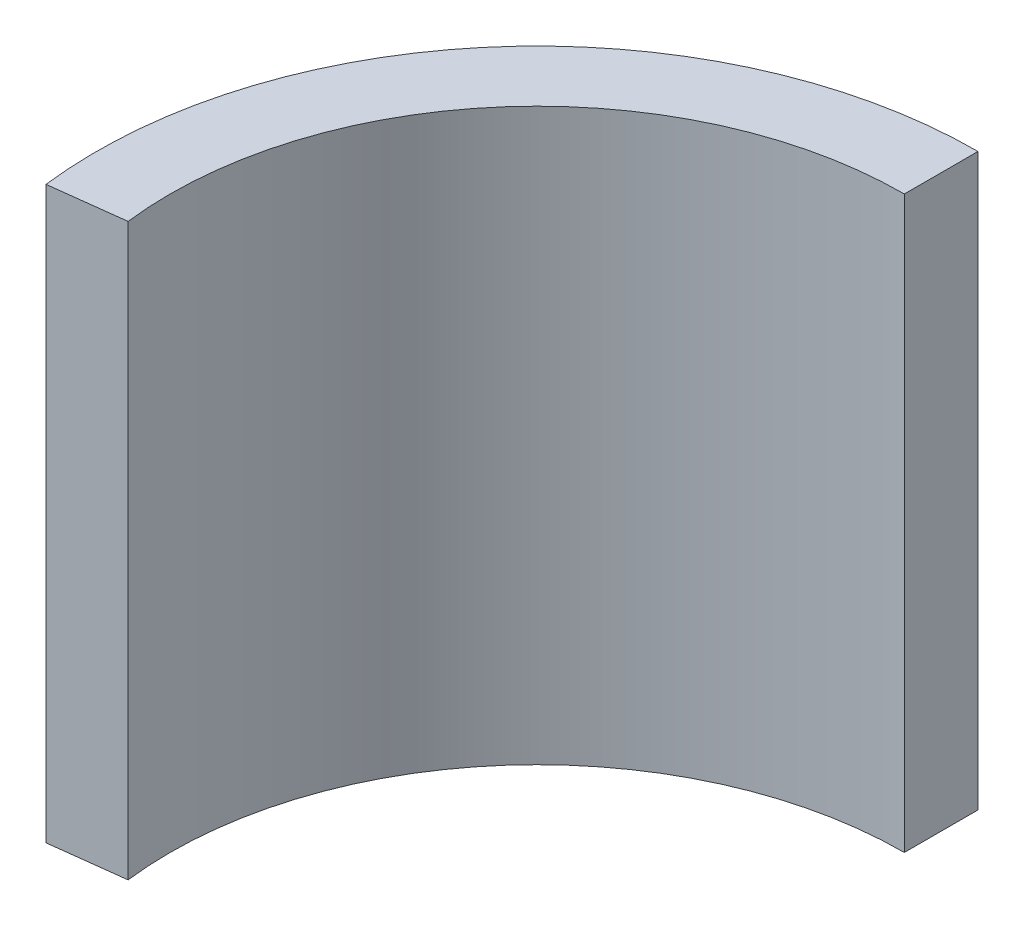
ISO-10303-21;
HEADER;
FILE_DESCRIPTION(('STEP AP214'),'2;1');
FILE_NAME('part.step','',(''),(''),'','','');
FILE_SCHEMA(('AUTOMOTIVE_DESIGN { 1 0 10303 214 1 1 1 1 }'));
ENDSEC;
DATA;
#1=APPLICATION_CONTEXT('core data for automotive mechanical design processes');
#2=APPLICATION_PROTOCOL_DEFINITION('international standard','automotive_design',2000,#1);
#3=PRODUCT_CONTEXT('',#1,'mechanical');
#4=PRODUCT('Part','Part','',(#3));
#5=PRODUCT_RELATED_PRODUCT_CATEGORY('part','',(#4));
#6=PRODUCT_DEFINITION_FORMATION('','',#4);
#7=PRODUCT_DEFINITION_CONTEXT('part definition',#1,'design');
#8=PRODUCT_DEFINITION('design','',#6,#7);
#9=PRODUCT_DEFINITION_SHAPE('','',#8);
#10=(LENGTH_UNIT() NAMED_UNIT(*) SI_UNIT(.MILLI.,.METRE.));
#11=(NAMED_UNIT(*) PLANE_ANGLE_UNIT() SI_UNIT($,.RADIAN.));
#12=(NAMED_UNIT(*) SI_UNIT($,.STERADIAN.) SOLID_ANGLE_UNIT());
#13=UNCERTAINTY_MEASURE_WITH_UNIT(LENGTH_MEASURE(1.E-05),#10,'distance_accuracy_value','');
#14=(GEOMETRIC_REPRESENTATION_CONTEXT(3) GLOBAL_UNCERTAINTY_ASSIGNED_CONTEXT((#13)) GLOBAL_UNIT_ASSIGNED_CONTEXT((#10,
#11,#12)) REPRESENTATION_CONTEXT('',''));
#15=CARTESIAN_POINT('',(0.,0.,0.));
#16=DIRECTION('',(0.,0.,1.));
#17=DIRECTION('',(1.,0.,0.));
#18=AXIS2_PLACEMENT_3D('',#15,#16,#17);
#19=CARTESIAN_POINT('',(0.,-18.,6.));
#20=DIRECTION('',(0.,-1.,0.));
#21=DIRECTION('',(0.,0.,-1.));
#22=AXIS2_PLACEMENT_3D('',#19,#20,#21);
#23=CYLINDRICAL_SURFACE('',#22,18.55);
#24=CARTESIAN_POINT('',(0.,-9.,6.));
#25=DIRECTION('',(0.,-1.,0.));
#26=DIRECTION('',(0.,0.,-1.));
#27=AXIS2_PLACEMENT_3D('',#24,#25,#26);
#28=CIRCLE('',#27,18.55);
#29=CARTESIAN_POINT('',(-18.4117311129465,-9.,8.26067632016548));
#30=VERTEX_POINT('',#29);
#31=CARTESIAN_POINT('',(0.,-9.,-12.55));
#32=VERTEX_POINT('',#31);
#33=EDGE_CURVE('E11',#30,#32,#28,.T.);
#34=ORIENTED_EDGE('',*,*,#33,.F.);
#35=DIRECTION('',(0.,1.,0.));
#36=VECTOR('',#35,1.);
#37=CARTESIAN_POINT('',(-18.4117311129465,-9.,8.26067632016548));
#38=LINE('',#37,#36);
#39=CARTESIAN_POINT('',(-18.4117311129465,15.,8.26067632016548));
#40=VERTEX_POINT('',#39);
#41=EDGE_CURVE('E87',#30,#40,#38,.T.);
#42=ORIENTED_EDGE('',*,*,#41,.T.);
#43=CARTESIAN_POINT('',(0.,15.,6.));
#44=DIRECTION('',(0.,-1.,0.));
#45=DIRECTION('',(0.,0.,-1.));
#46=AXIS2_PLACEMENT_3D('',#43,#44,#45);
#47=CIRCLE('',#46,18.55);
#48=CARTESIAN_POINT('',(0.,15.,-12.55));
#49=VERTEX_POINT('',#48);
#50=EDGE_CURVE('E84',#40,#49,#47,.T.);
#51=ORIENTED_EDGE('',*,*,#50,.T.);
#52=DIRECTION('',(0.,1.,0.));
#53=VECTOR('',#52,1.);
#54=CARTESIAN_POINT('',(0.,-9.,-12.55));
#55=LINE('',#54,#53);
#56=EDGE_CURVE('E81',#32,#49,#55,.T.);
#57=ORIENTED_EDGE('',*,*,#56,.F.);
#58=EDGE_LOOP('',(#34,#42,#51,#57));
#59=FACE_BOUND('',#58,.T.);
#60=ADVANCED_FACE('F44',(#59),#23,.T.);
#61=CARTESIAN_POINT('',(-18.4117311129465,-9.,8.26067632016548));
#62=DIRECTION('',(0.,1.,0.));
#63=DIRECTION('',(0.,0.,1.));
#64=AXIS2_PLACEMENT_3D('',#61,#62,#63);
#65=PLANE('',#64);
#66=CARTESIAN_POINT('',(0.,-9.,6.));
#67=DIRECTION('',(0.,-1.,0.));
#68=DIRECTION('',(0.,0.,-1.));
#69=AXIS2_PLACEMENT_3D('',#66,#67,#68);
#70=CIRCLE('',#69,15.45);
#71=CARTESIAN_POINT('',(-15.3348380428584,-9.,7.88288135560953));
#72=VERTEX_POINT('',#71);
#73=CARTESIAN_POINT('',(0.,-9.,-9.45));
#74=VERTEX_POINT('',#73);
#75=EDGE_CURVE('E53',#72,#74,#70,.T.);
#76=ORIENTED_EDGE('',*,*,#75,.F.);
#77=DIRECTION('',(0.992546151641322,0.,-0.121869343405147));
#78=VECTOR('',#77,1.);
#79=CARTESIAN_POINT('',(-18.4117311129465,-9.,8.26067632016548));
#80=LINE('',#79,#78);
#81=EDGE_CURVE('E91',#30,#72,#80,.T.);
#82=ORIENTED_EDGE('',*,*,#81,.F.);
#83=ORIENTED_EDGE('',*,*,#33,.T.);
#84=DIRECTION('',(0.,0.,1.));
#85=VECTOR('',#84,1.);
#86=CARTESIAN_POINT('',(0.,-9.,-12.55));
#87=LINE('',#86,#85);
#88=EDGE_CURVE('E106',#32,#74,#87,.T.);
#89=ORIENTED_EDGE('',*,*,#88,.T.);
#90=EDGE_LOOP('',(#76,#82,#83,#89));
#91=FACE_BOUND('',#90,.T.);
#92=ADVANCED_FACE('F50',(#91),#65,.F.);
#93=CARTESIAN_POINT('',(0.,-18.,6.));
#94=DIRECTION('',(0.,-1.,0.));
#95=DIRECTION('',(0.,0.,-1.));
#96=AXIS2_PLACEMENT_3D('',#93,#94,#95);
#97=CYLINDRICAL_SURFACE('',#96,15.45);
#98=CARTESIAN_POINT('',(0.,15.,6.));
#99=DIRECTION('',(0.,-1.,0.));
#100=DIRECTION('',(0.,0.,-1.));
#101=AXIS2_PLACEMENT_3D('',#98,#99,#100);
#102=CIRCLE('',#101,15.45);
#103=CARTESIAN_POINT('',(-15.3348380428584,15.,7.88288135560953));
#104=VERTEX_POINT('',#103);
#105=CARTESIAN_POINT('',(0.,15.,-9.45));
#106=VERTEX_POINT('',#105);
#107=EDGE_CURVE('E95',#104,#106,#102,.T.);
#108=ORIENTED_EDGE('',*,*,#107,.F.);
#109=DIRECTION('',(0.,1.,0.));
#110=VECTOR('',#109,1.);
#111=CARTESIAN_POINT('',(-15.3348380428584,-9.,7.88288135560953));
#112=LINE('',#111,#110);
#113=EDGE_CURVE('E116',#72,#104,#112,.T.);
#114=ORIENTED_EDGE('',*,*,#113,.F.);
#115=ORIENTED_EDGE('',*,*,#75,.T.);
#116=DIRECTION('',(0.,1.,0.));
#117=VECTOR('',#116,1.);
#118=CARTESIAN_POINT('',(0.,-9.,-9.45));
#119=LINE('',#118,#117);
#120=EDGE_CURVE('E105',#74,#106,#119,.T.);
#121=ORIENTED_EDGE('',*,*,#120,.T.);
#122=EDGE_LOOP('',(#108,#114,#115,#121));
#123=FACE_BOUND('',#122,.T.);
#124=ADVANCED_FACE('F129',(#123),#97,.F.);
#125=CARTESIAN_POINT('',(-15.3348380428584,15.,7.88288135560953));
#126=DIRECTION('',(0.,-1.,0.));
#127=DIRECTION('',(0.,0.,-1.));
#128=AXIS2_PLACEMENT_3D('',#125,#126,#127);
#129=PLANE('',#128);
#130=DIRECTION('',(-0.992546151641322,0.,0.121869343405147));
#131=VECTOR('',#130,1.);
#132=CARTESIAN_POINT('',(-15.3348380428584,15.,7.88288135560953));
#133=LINE('',#132,#131);
#134=EDGE_CURVE('E117',#104,#40,#133,.T.);
#135=ORIENTED_EDGE('',*,*,#134,.F.);
#136=ORIENTED_EDGE('',*,*,#107,.T.);
#137=DIRECTION('',(0.,0.,-1.));
#138=VECTOR('',#137,1.);
#139=CARTESIAN_POINT('',(0.,15.,-9.45));
#140=LINE('',#139,#138);
#141=EDGE_CURVE('E96',#106,#49,#140,.T.);
#142=ORIENTED_EDGE('',*,*,#141,.T.);
#143=ORIENTED_EDGE('',*,*,#50,.F.);
#144=EDGE_LOOP('',(#135,#136,#142,#143));
#145=FACE_BOUND('',#144,.T.);
#146=ADVANCED_FACE('F100',(#145),#129,.F.);
#147=CARTESIAN_POINT('',(-5.95527690984793,0.,6.73121606043089));
#148=DIRECTION('',(0.121869343405147,0.,0.992546151641322));
#149=DIRECTION('',(0.992546151641322,0.,-0.121869343405147));
#150=AXIS2_PLACEMENT_3D('',#147,#148,#149);
#151=PLANE('',#150);
#152=ORIENTED_EDGE('',*,*,#41,.F.);
#153=ORIENTED_EDGE('',*,*,#81,.T.);
#154=ORIENTED_EDGE('',*,*,#113,.T.);
#155=ORIENTED_EDGE('',*,*,#134,.T.);
#156=EDGE_LOOP('',(#152,#153,#154,#155));
#157=FACE_BOUND('',#156,.T.);
#158=ADVANCED_FACE('F132',(#157),#151,.T.);
#159=CARTESIAN_POINT('',(0.,0.,0.));
#160=DIRECTION('',(-1.,0.,0.));
#161=DIRECTION('',(0.,0.,1.));
#162=AXIS2_PLACEMENT_3D('',#159,#160,#161);
#163=PLANE('',#162);
#164=ORIENTED_EDGE('',*,*,#56,.T.);
#165=ORIENTED_EDGE('',*,*,#141,.F.);
#166=ORIENTED_EDGE('',*,*,#120,.F.);
#167=ORIENTED_EDGE('',*,*,#88,.F.);
#168=EDGE_LOOP('',(#164,#165,#166,#167));
#169=FACE_BOUND('',#168,.T.);
#170=ADVANCED_FACE('F104',(#169),#163,.F.);
#171=CLOSED_SHELL('',(#60,#92,#124,#146,#158,#170));
#172=MANIFOLD_SOLID_BREP('B2',#171);
#173=ADVANCED_BREP_SHAPE_REPRESENTATION('',(#18,#172),#14);
#174=SHAPE_DEFINITION_REPRESENTATION(#9,#173);
ENDSEC;
END-ISO-10303-21;
